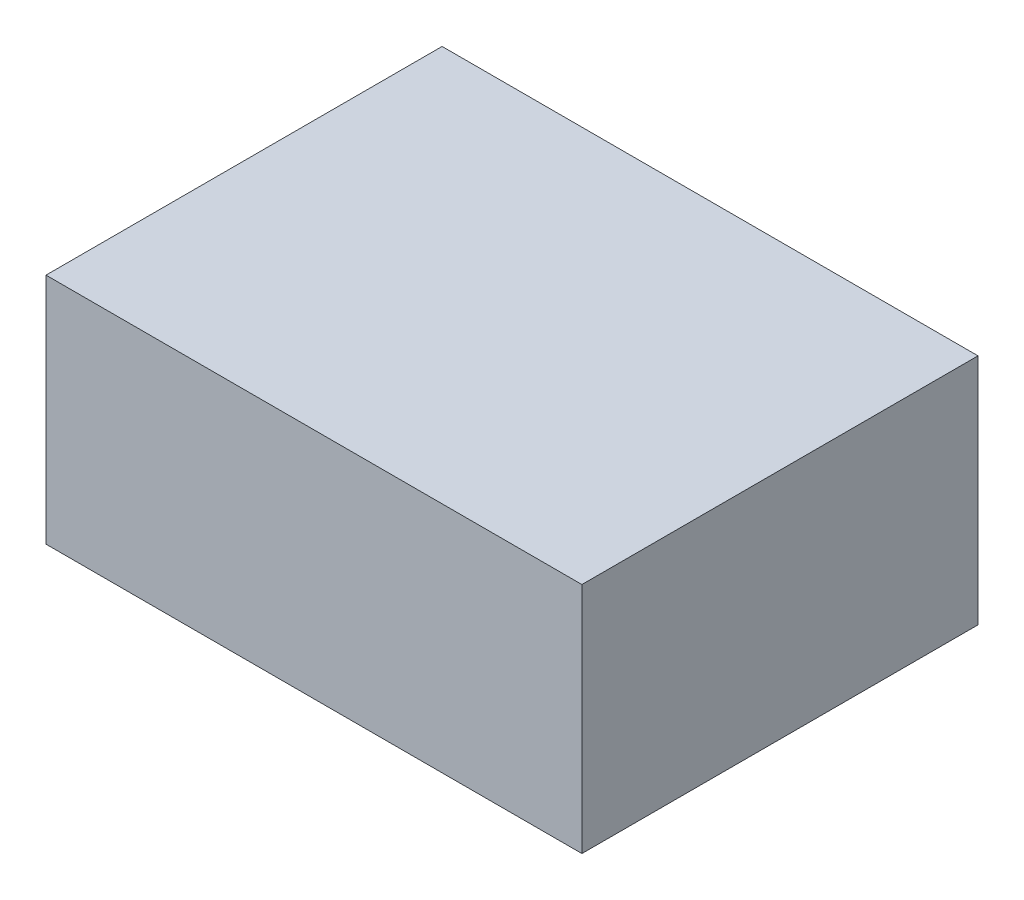
ISO-10303-21;
HEADER;
FILE_DESCRIPTION(('STEP AP214'),'2;1');
FILE_NAME('part.step','',(''),(''),'','','');
FILE_SCHEMA(('AUTOMOTIVE_DESIGN { 1 0 10303 214 1 1 1 1 }'));
ENDSEC;
DATA;
#1=APPLICATION_CONTEXT('core data for automotive mechanical design processes');
#2=APPLICATION_PROTOCOL_DEFINITION('international standard','automotive_design',2000,#1);
#3=PRODUCT_CONTEXT('',#1,'mechanical');
#4=PRODUCT('Part','Part','',(#3));
#5=PRODUCT_RELATED_PRODUCT_CATEGORY('part','',(#4));
#6=PRODUCT_DEFINITION_FORMATION('','',#4);
#7=PRODUCT_DEFINITION_CONTEXT('part definition',#1,'design');
#8=PRODUCT_DEFINITION('design','',#6,#7);
#9=PRODUCT_DEFINITION_SHAPE('','',#8);
#10=(LENGTH_UNIT() NAMED_UNIT(*) SI_UNIT(.MILLI.,.METRE.));
#11=(NAMED_UNIT(*) PLANE_ANGLE_UNIT() SI_UNIT($,.RADIAN.));
#12=(NAMED_UNIT(*) SI_UNIT($,.STERADIAN.) SOLID_ANGLE_UNIT());
#13=UNCERTAINTY_MEASURE_WITH_UNIT(LENGTH_MEASURE(1.E-05),#10,'distance_accuracy_value','');
#14=(GEOMETRIC_REPRESENTATION_CONTEXT(3) GLOBAL_UNCERTAINTY_ASSIGNED_CONTEXT((#13)) GLOBAL_UNIT_ASSIGNED_CONTEXT((#10,
#11,#12)) REPRESENTATION_CONTEXT('',''));
#15=CARTESIAN_POINT('',(0.,0.,0.));
#16=DIRECTION('',(0.,0.,1.));
#17=DIRECTION('',(1.,0.,0.));
#18=AXIS2_PLACEMENT_3D('',#15,#16,#17);
#19=CARTESIAN_POINT('',(115.,100.,85.));
#20=DIRECTION('',(-1.,0.,0.));
#21=DIRECTION('',(0.,0.,1.));
#22=AXIS2_PLACEMENT_3D('',#19,#20,#21);
#23=PLANE('',#22);
#24=DIRECTION('',(0.,0.,-1.));
#25=VECTOR('',#24,1.);
#26=CARTESIAN_POINT('',(115.,0.,85.));
#27=LINE('',#26,#25);
#28=CARTESIAN_POINT('',(115.,0.,85.));
#29=VERTEX_POINT('',#28);
#30=CARTESIAN_POINT('',(115.,0.,-85.));
#31=VERTEX_POINT('',#30);
#32=EDGE_CURVE('E117',#29,#31,#27,.T.);
#33=ORIENTED_EDGE('',*,*,#32,.T.);
#34=DIRECTION('',(0.,-1.,0.));
#35=VECTOR('',#34,1.);
#36=CARTESIAN_POINT('',(115.,100.,-85.));
#37=LINE('',#36,#35);
#38=CARTESIAN_POINT('',(115.,100.,-85.));
#39=VERTEX_POINT('',#38);
#40=EDGE_CURVE('E11',#39,#31,#37,.T.);
#41=ORIENTED_EDGE('',*,*,#40,.F.);
#42=DIRECTION('',(0.,0.,-1.));
#43=VECTOR('',#42,1.);
#44=CARTESIAN_POINT('',(115.,100.,85.));
#45=LINE('',#44,#43);
#46=CARTESIAN_POINT('',(115.,100.,85.));
#47=VERTEX_POINT('',#46);
#48=EDGE_CURVE('E101',#47,#39,#45,.T.);
#49=ORIENTED_EDGE('',*,*,#48,.F.);
#50=DIRECTION('',(0.,-1.,0.));
#51=VECTOR('',#50,1.);
#52=CARTESIAN_POINT('',(115.,100.,85.));
#53=LINE('',#52,#51);
#54=EDGE_CURVE('E113',#47,#29,#53,.T.);
#55=ORIENTED_EDGE('',*,*,#54,.T.);
#56=EDGE_LOOP('',(#33,#41,#49,#55));
#57=FACE_BOUND('',#56,.T.);
#58=ADVANCED_FACE('F49',(#57),#23,.F.);
#59=CARTESIAN_POINT('',(-115.,100.,-85.));
#60=DIRECTION('',(0.,0.,1.));
#61=DIRECTION('',(1.,0.,0.));
#62=AXIS2_PLACEMENT_3D('',#59,#60,#61);
#63=PLANE('',#62);
#64=DIRECTION('',(-1.,0.,0.));
#65=VECTOR('',#64,1.);
#66=CARTESIAN_POINT('',(-115.,0.,-85.));
#67=LINE('',#66,#65);
#68=CARTESIAN_POINT('',(-115.,0.,-85.));
#69=VERTEX_POINT('',#68);
#70=EDGE_CURVE('E106',#31,#69,#67,.T.);
#71=ORIENTED_EDGE('',*,*,#70,.T.);
#72=DIRECTION('',(0.,-1.,0.));
#73=VECTOR('',#72,1.);
#74=CARTESIAN_POINT('',(-115.,100.,-85.));
#75=LINE('',#74,#73);
#76=CARTESIAN_POINT('',(-115.,100.,-85.));
#77=VERTEX_POINT('',#76);
#78=EDGE_CURVE('E58',#77,#69,#75,.T.);
#79=ORIENTED_EDGE('',*,*,#78,.F.);
#80=DIRECTION('',(-1.,0.,0.));
#81=VECTOR('',#80,1.);
#82=CARTESIAN_POINT('',(-115.,100.,-85.));
#83=LINE('',#82,#81);
#84=EDGE_CURVE('E96',#39,#77,#83,.T.);
#85=ORIENTED_EDGE('',*,*,#84,.F.);
#86=ORIENTED_EDGE('',*,*,#40,.T.);
#87=EDGE_LOOP('',(#71,#79,#85,#86));
#88=FACE_BOUND('',#87,.T.);
#89=ADVANCED_FACE('F105',(#88),#63,.F.);
#90=CARTESIAN_POINT('',(-115.,100.,85.));
#91=DIRECTION('',(1.,0.,0.));
#92=DIRECTION('',(0.,0.,-1.));
#93=AXIS2_PLACEMENT_3D('',#90,#91,#92);
#94=PLANE('',#93);
#95=DIRECTION('',(0.,0.,1.));
#96=VECTOR('',#95,1.);
#97=CARTESIAN_POINT('',(-115.,0.,85.));
#98=LINE('',#97,#96);
#99=CARTESIAN_POINT('',(-115.,0.,85.));
#100=VERTEX_POINT('',#99);
#101=EDGE_CURVE('E83',#69,#100,#98,.T.);
#102=ORIENTED_EDGE('',*,*,#101,.T.);
#103=DIRECTION('',(0.,-1.,0.));
#104=VECTOR('',#103,1.);
#105=CARTESIAN_POINT('',(-115.,100.,85.));
#106=LINE('',#105,#104);
#107=CARTESIAN_POINT('',(-115.,100.,85.));
#108=VERTEX_POINT('',#107);
#109=EDGE_CURVE('E108',#108,#100,#106,.T.);
#110=ORIENTED_EDGE('',*,*,#109,.F.);
#111=DIRECTION('',(0.,0.,1.));
#112=VECTOR('',#111,1.);
#113=CARTESIAN_POINT('',(-115.,100.,85.));
#114=LINE('',#113,#112);
#115=EDGE_CURVE('E99',#77,#108,#114,.T.);
#116=ORIENTED_EDGE('',*,*,#115,.F.);
#117=ORIENTED_EDGE('',*,*,#78,.T.);
#118=EDGE_LOOP('',(#102,#110,#116,#117));
#119=FACE_BOUND('',#118,.T.);
#120=ADVANCED_FACE('F109',(#119),#94,.F.);
#121=CARTESIAN_POINT('',(-115.,100.,85.));
#122=DIRECTION('',(0.,0.,-1.));
#123=DIRECTION('',(-1.,0.,0.));
#124=AXIS2_PLACEMENT_3D('',#121,#122,#123);
#125=PLANE('',#124);
#126=DIRECTION('',(1.,0.,0.));
#127=VECTOR('',#126,1.);
#128=CARTESIAN_POINT('',(-115.,0.,85.));
#129=LINE('',#128,#127);
#130=EDGE_CURVE('E89',#100,#29,#129,.T.);
#131=ORIENTED_EDGE('',*,*,#130,.T.);
#132=ORIENTED_EDGE('',*,*,#54,.F.);
#133=DIRECTION('',(1.,0.,0.));
#134=VECTOR('',#133,1.);
#135=CARTESIAN_POINT('',(-115.,100.,85.));
#136=LINE('',#135,#134);
#137=EDGE_CURVE('E66',#108,#47,#136,.T.);
#138=ORIENTED_EDGE('',*,*,#137,.F.);
#139=ORIENTED_EDGE('',*,*,#109,.T.);
#140=EDGE_LOOP('',(#131,#132,#138,#139));
#141=FACE_BOUND('',#140,.T.);
#142=ADVANCED_FACE('F130',(#141),#125,.F.);
#143=CARTESIAN_POINT('',(0.,100.,0.));
#144=DIRECTION('',(0.,-1.,0.));
#145=DIRECTION('',(0.,0.,-1.));
#146=AXIS2_PLACEMENT_3D('',#143,#144,#145);
#147=PLANE('',#146);
#148=ORIENTED_EDGE('',*,*,#48,.T.);
#149=ORIENTED_EDGE('',*,*,#84,.T.);
#150=ORIENTED_EDGE('',*,*,#115,.T.);
#151=ORIENTED_EDGE('',*,*,#137,.T.);
#152=EDGE_LOOP('',(#148,#149,#150,#151));
#153=FACE_BOUND('',#152,.T.);
#154=ADVANCED_FACE('F97',(#153),#147,.F.);
#155=CARTESIAN_POINT('',(0.,0.,0.));
#156=DIRECTION('',(0.,-1.,0.));
#157=DIRECTION('',(0.,0.,-1.));
#158=AXIS2_PLACEMENT_3D('',#155,#156,#157);
#159=PLANE('',#158);
#160=ORIENTED_EDGE('',*,*,#32,.F.);
#161=ORIENTED_EDGE('',*,*,#130,.F.);
#162=ORIENTED_EDGE('',*,*,#101,.F.);
#163=ORIENTED_EDGE('',*,*,#70,.F.);
#164=EDGE_LOOP('',(#160,#161,#162,#163));
#165=FACE_BOUND('',#164,.T.);
#166=ADVANCED_FACE('F133',(#165),#159,.T.);
#167=CLOSED_SHELL('',(#58,#89,#120,#142,#154,#166));
#168=MANIFOLD_SOLID_BREP('B2',#167);
#169=ADVANCED_BREP_SHAPE_REPRESENTATION('',(#18,#168),#14);
#170=SHAPE_DEFINITION_REPRESENTATION(#9,#169);
ENDSEC;
END-ISO-10303-21;
